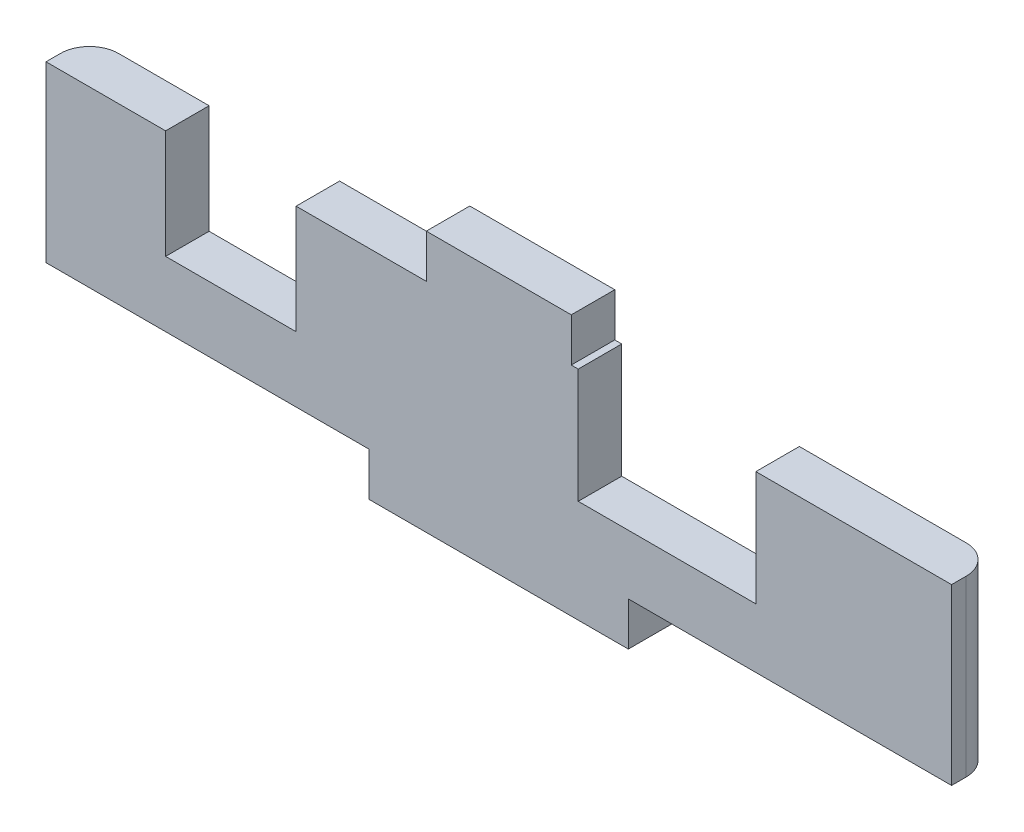
ISO-10303-21;
HEADER;
FILE_DESCRIPTION(('STEP AP214'),'2;1');
FILE_NAME('part.step','',(''),(''),'','','');
FILE_SCHEMA(('AUTOMOTIVE_DESIGN { 1 0 10303 214 1 1 1 1 }'));
ENDSEC;
DATA;
#1=APPLICATION_CONTEXT('core data for automotive mechanical design processes');
#2=APPLICATION_PROTOCOL_DEFINITION('international standard','automotive_design',2000,#1);
#3=PRODUCT_CONTEXT('',#1,'mechanical');
#4=PRODUCT('Part','Part','',(#3));
#5=PRODUCT_RELATED_PRODUCT_CATEGORY('part','',(#4));
#6=PRODUCT_DEFINITION_FORMATION('','',#4);
#7=PRODUCT_DEFINITION_CONTEXT('part definition',#1,'design');
#8=PRODUCT_DEFINITION('design','',#6,#7);
#9=PRODUCT_DEFINITION_SHAPE('','',#8);
#10=(LENGTH_UNIT() NAMED_UNIT(*) SI_UNIT(.MILLI.,.METRE.));
#11=(NAMED_UNIT(*) PLANE_ANGLE_UNIT() SI_UNIT($,.RADIAN.));
#12=(NAMED_UNIT(*) SI_UNIT($,.STERADIAN.) SOLID_ANGLE_UNIT());
#13=UNCERTAINTY_MEASURE_WITH_UNIT(LENGTH_MEASURE(1.E-05),#10,'distance_accuracy_value','');
#14=(GEOMETRIC_REPRESENTATION_CONTEXT(3) GLOBAL_UNCERTAINTY_ASSIGNED_CONTEXT((#13)) GLOBAL_UNIT_ASSIGNED_CONTEXT((#10,
#11,#12)) REPRESENTATION_CONTEXT('',''));
#15=CARTESIAN_POINT('',(0.,0.,0.));
#16=DIRECTION('',(0.,0.,1.));
#17=DIRECTION('',(1.,0.,0.));
#18=AXIS2_PLACEMENT_3D('',#15,#16,#17);
#19=CARTESIAN_POINT('',(31.23,9.,3.));
#20=DIRECTION('',(-1.,0.,0.));
#21=DIRECTION('',(0.,-1.,0.));
#22=AXIS2_PLACEMENT_3D('',#19,#20,#21);
#23=PLANE('',#22);
#24=DIRECTION('',(0.,0.,1.));
#25=VECTOR('',#24,1.);
#26=CARTESIAN_POINT('',(31.23,-5.99999999999999,0.));
#27=LINE('',#26,#25);
#28=CARTESIAN_POINT('',(31.23,-5.99999999999999,2.));
#29=VERTEX_POINT('',#28);
#30=CARTESIAN_POINT('',(31.23,-5.99999999999999,3.));
#31=VERTEX_POINT('',#30);
#32=EDGE_CURVE('E359',#29,#31,#27,.T.);
#33=ORIENTED_EDGE('',*,*,#32,.F.);
#34=DIRECTION('',(0.,1.,0.));
#35=VECTOR('',#34,1.);
#36=CARTESIAN_POINT('',(31.23,9.,2.));
#37=LINE('',#36,#35);
#38=CARTESIAN_POINT('',(31.23,6.,2.));
#39=VERTEX_POINT('',#38);
#40=EDGE_CURVE('E196',#29,#39,#37,.T.);
#41=ORIENTED_EDGE('',*,*,#40,.T.);
#42=DIRECTION('',(0.,0.,-1.));
#43=VECTOR('',#42,1.);
#44=CARTESIAN_POINT('',(31.23,6.,3.));
#45=LINE('',#44,#43);
#46=CARTESIAN_POINT('',(31.23,6.,3.));
#47=VERTEX_POINT('',#46);
#48=EDGE_CURVE('E180',#47,#39,#45,.T.);
#49=ORIENTED_EDGE('',*,*,#48,.F.);
#50=DIRECTION('',(0.,1.,0.));
#51=VECTOR('',#50,1.);
#52=CARTESIAN_POINT('',(31.23,9.,3.));
#53=LINE('',#52,#51);
#54=EDGE_CURVE('E194',#31,#47,#53,.T.);
#55=ORIENTED_EDGE('',*,*,#54,.F.);
#56=EDGE_LOOP('',(#33,#41,#49,#55));
#57=FACE_BOUND('',#56,.T.);
#58=ADVANCED_FACE('F32',(#57),#23,.F.);
#59=CARTESIAN_POINT('',(-31.23,9.,3.));
#60=DIRECTION('',(0.,-1.,0.));
#61=DIRECTION('',(0.,0.,-1.));
#62=AXIS2_PLACEMENT_3D('',#59,#60,#61);
#63=PLANE('',#62);
#64=DIRECTION('',(-1.,0.,0.));
#65=VECTOR('',#64,1.);
#66=CARTESIAN_POINT('',(-31.23,9.,3.));
#67=LINE('',#66,#65);
#68=CARTESIAN_POINT('',(5.,9.,3.));
#69=VERTEX_POINT('',#68);
#70=CARTESIAN_POINT('',(-5.,9.,3.));
#71=VERTEX_POINT('',#70);
#72=EDGE_CURVE('E205',#69,#71,#67,.T.);
#73=ORIENTED_EDGE('',*,*,#72,.F.);
#74=DIRECTION('',(0.,0.,-1.));
#75=VECTOR('',#74,1.);
#76=CARTESIAN_POINT('',(5.,9.,3.));
#77=LINE('',#76,#75);
#78=CARTESIAN_POINT('',(5.,9.,0.));
#79=VERTEX_POINT('',#78);
#80=EDGE_CURVE('E312',#69,#79,#77,.T.);
#81=ORIENTED_EDGE('',*,*,#80,.T.);
#82=DIRECTION('',(-1.,0.,0.));
#83=VECTOR('',#82,1.);
#84=CARTESIAN_POINT('',(-31.23,9.,0.));
#85=LINE('',#84,#83);
#86=CARTESIAN_POINT('',(-5.,9.,0.));
#87=VERTEX_POINT('',#86);
#88=EDGE_CURVE('E212',#79,#87,#85,.T.);
#89=ORIENTED_EDGE('',*,*,#88,.T.);
#90=DIRECTION('',(0.,0.,-1.));
#91=VECTOR('',#90,1.);
#92=CARTESIAN_POINT('',(-5.,9.,3.));
#93=LINE('',#92,#91);
#94=EDGE_CURVE('E299',#71,#87,#93,.T.);
#95=ORIENTED_EDGE('',*,*,#94,.F.);
#96=EDGE_LOOP('',(#73,#81,#89,#95));
#97=FACE_BOUND('',#96,.T.);
#98=ADVANCED_FACE('F375',(#97),#63,.F.);
#99=CARTESIAN_POINT('',(-31.23,9.,3.));
#100=DIRECTION('',(1.,0.,0.));
#101=DIRECTION('',(0.,1.,0.));
#102=AXIS2_PLACEMENT_3D('',#99,#100,#101);
#103=PLANE('',#102);
#104=DIRECTION('',(0.,0.,-1.));
#105=VECTOR('',#104,1.);
#106=CARTESIAN_POINT('',(-31.23,6.,3.));
#107=LINE('',#106,#105);
#108=CARTESIAN_POINT('',(-31.23,6.,3.));
#109=VERTEX_POINT('',#108);
#110=CARTESIAN_POINT('',(-31.23,6.,2.));
#111=VERTEX_POINT('',#110);
#112=EDGE_CURVE('E247',#109,#111,#107,.T.);
#113=ORIENTED_EDGE('',*,*,#112,.T.);
#114=DIRECTION('',(0.,-1.,0.));
#115=VECTOR('',#114,1.);
#116=CARTESIAN_POINT('',(-31.23,9.,2.));
#117=LINE('',#116,#115);
#118=CARTESIAN_POINT('',(-31.23,-6.,2.));
#119=VERTEX_POINT('',#118);
#120=EDGE_CURVE('E232',#111,#119,#117,.T.);
#121=ORIENTED_EDGE('',*,*,#120,.T.);
#122=DIRECTION('',(0.,0.,1.));
#123=VECTOR('',#122,1.);
#124=CARTESIAN_POINT('',(-31.23,-6.,0.));
#125=LINE('',#124,#123);
#126=CARTESIAN_POINT('',(-31.23,-6.,3.));
#127=VERTEX_POINT('',#126);
#128=EDGE_CURVE('E268',#119,#127,#125,.T.);
#129=ORIENTED_EDGE('',*,*,#128,.T.);
#130=DIRECTION('',(0.,-1.,0.));
#131=VECTOR('',#130,1.);
#132=CARTESIAN_POINT('',(-31.23,9.,3.));
#133=LINE('',#132,#131);
#134=EDGE_CURVE('E209',#109,#127,#133,.T.);
#135=ORIENTED_EDGE('',*,*,#134,.F.);
#136=EDGE_LOOP('',(#113,#121,#129,#135));
#137=FACE_BOUND('',#136,.T.);
#138=ADVANCED_FACE('F256',(#137),#103,.F.);
#139=CARTESIAN_POINT('',(-31.23,-9.,3.));
#140=DIRECTION('',(0.,1.,0.));
#141=DIRECTION('',(0.,0.,1.));
#142=AXIS2_PLACEMENT_3D('',#139,#140,#141);
#143=PLANE('',#142);
#144=DIRECTION('',(1.,0.,0.));
#145=VECTOR('',#144,1.);
#146=CARTESIAN_POINT('',(-31.23,-9.,0.));
#147=LINE('',#146,#145);
#148=CARTESIAN_POINT('',(-8.935,-9.00000000000001,0.));
#149=VERTEX_POINT('',#148);
#150=CARTESIAN_POINT('',(8.93500000000001,-9.,0.));
#151=VERTEX_POINT('',#150);
#152=EDGE_CURVE('E206',#149,#151,#147,.T.);
#153=ORIENTED_EDGE('',*,*,#152,.T.);
#154=DIRECTION('',(0.,0.,1.));
#155=VECTOR('',#154,1.);
#156=CARTESIAN_POINT('',(8.93500000000001,-9.,0.));
#157=LINE('',#156,#155);
#158=CARTESIAN_POINT('',(8.93500000000001,-9.,3.));
#159=VERTEX_POINT('',#158);
#160=EDGE_CURVE('E225',#151,#159,#157,.T.);
#161=ORIENTED_EDGE('',*,*,#160,.T.);
#162=DIRECTION('',(1.,0.,0.));
#163=VECTOR('',#162,1.);
#164=CARTESIAN_POINT('',(-31.23,-9.,3.));
#165=LINE('',#164,#163);
#166=CARTESIAN_POINT('',(-8.935,-9.00000000000001,3.));
#167=VERTEX_POINT('',#166);
#168=EDGE_CURVE('E220',#167,#159,#165,.T.);
#169=ORIENTED_EDGE('',*,*,#168,.F.);
#170=DIRECTION('',(0.,0.,1.));
#171=VECTOR('',#170,1.);
#172=CARTESIAN_POINT('',(-8.935,-9.00000000000001,0.));
#173=LINE('',#172,#171);
#174=EDGE_CURVE('E215',#149,#167,#173,.T.);
#175=ORIENTED_EDGE('',*,*,#174,.F.);
#176=EDGE_LOOP('',(#153,#161,#169,#175));
#177=FACE_BOUND('',#176,.T.);
#178=ADVANCED_FACE('F385',(#177),#143,.F.);
#179=CARTESIAN_POINT('',(0.,0.,3.));
#180=DIRECTION('',(0.,0.,1.));
#181=DIRECTION('',(1.,0.,0.));
#182=AXIS2_PLACEMENT_3D('',#179,#180,#181);
#183=PLANE('',#182);
#184=DIRECTION('',(0.,1.,0.));
#185=VECTOR('',#184,1.);
#186=CARTESIAN_POINT('',(5.,9.,3.));
#187=LINE('',#186,#185);
#188=CARTESIAN_POINT('',(5.,6.,3.));
#189=VERTEX_POINT('',#188);
#190=EDGE_CURVE('E187',#189,#69,#187,.T.);
#191=ORIENTED_EDGE('',*,*,#190,.T.);
#192=ORIENTED_EDGE('',*,*,#72,.T.);
#193=DIRECTION('',(0.,-1.,0.));
#194=VECTOR('',#193,1.);
#195=CARTESIAN_POINT('',(-5.,9.,3.));
#196=LINE('',#195,#194);
#197=CARTESIAN_POINT('',(-5.,6.,3.));
#198=VERTEX_POINT('',#197);
#199=EDGE_CURVE('E296',#71,#198,#196,.T.);
#200=ORIENTED_EDGE('',*,*,#199,.T.);
#201=DIRECTION('',(-1.,0.,0.));
#202=VECTOR('',#201,1.);
#203=CARTESIAN_POINT('',(-31.23,6.,3.));
#204=LINE('',#203,#202);
#205=CARTESIAN_POINT('',(-13.98,6.,3.));
#206=VERTEX_POINT('',#205);
#207=EDGE_CURVE('E295',#198,#206,#204,.T.);
#208=ORIENTED_EDGE('',*,*,#207,.T.);
#209=DIRECTION('',(0.,1.,0.));
#210=VECTOR('',#209,1.);
#211=CARTESIAN_POINT('',(-13.98,9.,3.));
#212=LINE('',#211,#210);
#213=CARTESIAN_POINT('',(-13.98,-1.5,3.));
#214=VERTEX_POINT('',#213);
#215=EDGE_CURVE('E337',#214,#206,#212,.T.);
#216=ORIENTED_EDGE('',*,*,#215,.F.);
#217=DIRECTION('',(1.,0.,0.));
#218=VECTOR('',#217,1.);
#219=CARTESIAN_POINT('',(-22.98,-1.5,3.));
#220=LINE('',#219,#218);
#221=CARTESIAN_POINT('',(-22.98,-1.5,3.));
#222=VERTEX_POINT('',#221);
#223=EDGE_CURVE('E345',#222,#214,#220,.T.);
#224=ORIENTED_EDGE('',*,*,#223,.F.);
#225=DIRECTION('',(0.,-1.,0.));
#226=VECTOR('',#225,1.);
#227=CARTESIAN_POINT('',(-22.98,9.,3.));
#228=LINE('',#227,#226);
#229=CARTESIAN_POINT('',(-22.98,6.,3.));
#230=VERTEX_POINT('',#229);
#231=EDGE_CURVE('E293',#230,#222,#228,.T.);
#232=ORIENTED_EDGE('',*,*,#231,.F.);
#233=EDGE_CURVE('E291',#230,#109,#204,.T.);
#234=ORIENTED_EDGE('',*,*,#233,.T.);
#235=ORIENTED_EDGE('',*,*,#134,.T.);
#236=DIRECTION('',(-1.,0.,0.));
#237=VECTOR('',#236,1.);
#238=CARTESIAN_POINT('',(-31.23,-6.,3.));
#239=LINE('',#238,#237);
#240=CARTESIAN_POINT('',(-8.935,-6.,3.));
#241=VERTEX_POINT('',#240);
#242=EDGE_CURVE('E275',#241,#127,#239,.T.);
#243=ORIENTED_EDGE('',*,*,#242,.F.);
#244=DIRECTION('',(0.,1.,0.));
#245=VECTOR('',#244,1.);
#246=CARTESIAN_POINT('',(-8.935,-9.00000000000001,3.));
#247=LINE('',#246,#245);
#248=EDGE_CURVE('E279',#167,#241,#247,.T.);
#249=ORIENTED_EDGE('',*,*,#248,.F.);
#250=ORIENTED_EDGE('',*,*,#168,.T.);
#251=DIRECTION('',(0.,-1.,0.));
#252=VECTOR('',#251,1.);
#253=CARTESIAN_POINT('',(8.93500000000001,-9.,3.));
#254=LINE('',#253,#252);
#255=CARTESIAN_POINT('',(8.93500000000001,-6.,3.));
#256=VERTEX_POINT('',#255);
#257=EDGE_CURVE('E356',#256,#159,#254,.T.);
#258=ORIENTED_EDGE('',*,*,#257,.F.);
#259=DIRECTION('',(-1.,0.,0.));
#260=VECTOR('',#259,1.);
#261=CARTESIAN_POINT('',(31.23,-5.99999999999999,3.));
#262=LINE('',#261,#260);
#263=EDGE_CURVE('E204',#31,#256,#262,.T.);
#264=ORIENTED_EDGE('',*,*,#263,.F.);
#265=ORIENTED_EDGE('',*,*,#54,.T.);
#266=DIRECTION('',(-1.,0.,0.));
#267=VECTOR('',#266,1.);
#268=CARTESIAN_POINT('',(31.23,6.,3.));
#269=LINE('',#268,#267);
#270=CARTESIAN_POINT('',(17.73,6.,3.));
#271=VERTEX_POINT('',#270);
#272=EDGE_CURVE('E177',#47,#271,#269,.T.);
#273=ORIENTED_EDGE('',*,*,#272,.T.);
#274=DIRECTION('',(0.,1.,0.));
#275=VECTOR('',#274,1.);
#276=CARTESIAN_POINT('',(17.73,9.,3.));
#277=LINE('',#276,#275);
#278=CARTESIAN_POINT('',(17.73,-1.9,3.));
#279=VERTEX_POINT('',#278);
#280=EDGE_CURVE('E324',#279,#271,#277,.T.);
#281=ORIENTED_EDGE('',*,*,#280,.F.);
#282=DIRECTION('',(1.,0.,0.));
#283=VECTOR('',#282,1.);
#284=CARTESIAN_POINT('',(17.73,-1.9,3.));
#285=LINE('',#284,#283);
#286=CARTESIAN_POINT('',(5.48000000000001,-1.9,3.));
#287=VERTEX_POINT('',#286);
#288=EDGE_CURVE('E318',#287,#279,#285,.T.);
#289=ORIENTED_EDGE('',*,*,#288,.F.);
#290=DIRECTION('',(0.,-1.,0.));
#291=VECTOR('',#290,1.);
#292=CARTESIAN_POINT('',(5.48,9.,3.));
#293=LINE('',#292,#291);
#294=CARTESIAN_POINT('',(5.48,6.,3.));
#295=VERTEX_POINT('',#294);
#296=EDGE_CURVE('E326',#295,#287,#293,.T.);
#297=ORIENTED_EDGE('',*,*,#296,.F.);
#298=EDGE_CURVE('E188',#295,#189,#269,.T.);
#299=ORIENTED_EDGE('',*,*,#298,.T.);
#300=EDGE_LOOP('',(#191,#192,#200,#208,#216,#224,#232,#234,#235,#243,#249,#250,#258,#264,#265,
#273,#281,#289,#297,#299));
#301=FACE_BOUND('',#300,.T.);
#302=ADVANCED_FACE('F201',(#301),#183,.T.);
#303=CARTESIAN_POINT('',(0.,0.,0.));
#304=DIRECTION('',(0.,0.,1.));
#305=DIRECTION('',(1.,0.,0.));
#306=AXIS2_PLACEMENT_3D('',#303,#304,#305);
#307=PLANE('',#306);
#308=DIRECTION('',(-1.,0.,0.));
#309=VECTOR('',#308,1.);
#310=CARTESIAN_POINT('',(31.23,6.,0.));
#311=LINE('',#310,#309);
#312=CARTESIAN_POINT('',(29.23,6.,0.));
#313=VERTEX_POINT('',#312);
#314=CARTESIAN_POINT('',(17.73,6.,0.));
#315=VERTEX_POINT('',#314);
#316=EDGE_CURVE('E451',#313,#315,#311,.T.);
#317=ORIENTED_EDGE('',*,*,#316,.F.);
#318=DIRECTION('',(0.,1.,0.));
#319=VECTOR('',#318,1.);
#320=CARTESIAN_POINT('',(29.23,0.,0.));
#321=LINE('',#320,#319);
#322=CARTESIAN_POINT('',(29.23,-5.99999999999999,0.));
#323=VERTEX_POINT('',#322);
#324=EDGE_CURVE('E40',#313,#323,#321,.F.);
#325=ORIENTED_EDGE('',*,*,#324,.T.);
#326=DIRECTION('',(-1.,0.,0.));
#327=VECTOR('',#326,1.);
#328=CARTESIAN_POINT('',(31.23,-5.99999999999999,0.));
#329=LINE('',#328,#327);
#330=CARTESIAN_POINT('',(8.93500000000001,-6.,0.));
#331=VERTEX_POINT('',#330);
#332=EDGE_CURVE('E353',#323,#331,#329,.T.);
#333=ORIENTED_EDGE('',*,*,#332,.T.);
#334=DIRECTION('',(0.,-1.,0.));
#335=VECTOR('',#334,1.);
#336=CARTESIAN_POINT('',(8.93500000000001,-9.,0.));
#337=LINE('',#336,#335);
#338=EDGE_CURVE('E355',#331,#151,#337,.T.);
#339=ORIENTED_EDGE('',*,*,#338,.T.);
#340=ORIENTED_EDGE('',*,*,#152,.F.);
#341=DIRECTION('',(0.,1.,0.));
#342=VECTOR('',#341,1.);
#343=CARTESIAN_POINT('',(-8.935,-9.00000000000001,0.));
#344=LINE('',#343,#342);
#345=CARTESIAN_POINT('',(-8.935,-6.,0.));
#346=VERTEX_POINT('',#345);
#347=EDGE_CURVE('E272',#149,#346,#344,.T.);
#348=ORIENTED_EDGE('',*,*,#347,.T.);
#349=DIRECTION('',(-1.,0.,0.));
#350=VECTOR('',#349,1.);
#351=CARTESIAN_POINT('',(-31.23,-6.,0.));
#352=LINE('',#351,#350);
#353=CARTESIAN_POINT('',(-29.23,-6.,0.));
#354=VERTEX_POINT('',#353);
#355=EDGE_CURVE('E265',#346,#354,#352,.T.);
#356=ORIENTED_EDGE('',*,*,#355,.T.);
#357=DIRECTION('',(0.,-1.,0.));
#358=VECTOR('',#357,1.);
#359=CARTESIAN_POINT('',(-29.23,0.,0.));
#360=LINE('',#359,#358);
#361=CARTESIAN_POINT('',(-29.23,6.,0.));
#362=VERTEX_POINT('',#361);
#363=EDGE_CURVE('E237',#354,#362,#360,.F.);
#364=ORIENTED_EDGE('',*,*,#363,.T.);
#365=DIRECTION('',(-1.,0.,0.));
#366=VECTOR('',#365,1.);
#367=CARTESIAN_POINT('',(-31.23,6.,0.));
#368=LINE('',#367,#366);
#369=CARTESIAN_POINT('',(-22.98,6.,0.));
#370=VERTEX_POINT('',#369);
#371=EDGE_CURVE('E250',#370,#362,#368,.T.);
#372=ORIENTED_EDGE('',*,*,#371,.F.);
#373=DIRECTION('',(0.,-1.,0.));
#374=VECTOR('',#373,1.);
#375=CARTESIAN_POINT('',(-22.98,9.,0.));
#376=LINE('',#375,#374);
#377=CARTESIAN_POINT('',(-22.98,-1.5,0.));
#378=VERTEX_POINT('',#377);
#379=EDGE_CURVE('E334',#370,#378,#376,.T.);
#380=ORIENTED_EDGE('',*,*,#379,.T.);
#381=DIRECTION('',(1.,0.,0.));
#382=VECTOR('',#381,1.);
#383=CARTESIAN_POINT('',(-22.98,-1.5,0.));
#384=LINE('',#383,#382);
#385=CARTESIAN_POINT('',(-13.98,-1.5,0.));
#386=VERTEX_POINT('',#385);
#387=EDGE_CURVE('E336',#378,#386,#384,.T.);
#388=ORIENTED_EDGE('',*,*,#387,.T.);
#389=DIRECTION('',(0.,1.,0.));
#390=VECTOR('',#389,1.);
#391=CARTESIAN_POINT('',(-13.98,9.,0.));
#392=LINE('',#391,#390);
#393=CARTESIAN_POINT('',(-13.98,6.,0.));
#394=VERTEX_POINT('',#393);
#395=EDGE_CURVE('E340',#386,#394,#392,.T.);
#396=ORIENTED_EDGE('',*,*,#395,.T.);
#397=CARTESIAN_POINT('',(-5.,6.,0.));
#398=VERTEX_POINT('',#397);
#399=EDGE_CURVE('E301',#398,#394,#368,.T.);
#400=ORIENTED_EDGE('',*,*,#399,.F.);
#401=DIRECTION('',(0.,-1.,0.));
#402=VECTOR('',#401,1.);
#403=CARTESIAN_POINT('',(-5.,9.,0.));
#404=LINE('',#403,#402);
#405=EDGE_CURVE('E304',#87,#398,#404,.T.);
#406=ORIENTED_EDGE('',*,*,#405,.F.);
#407=ORIENTED_EDGE('',*,*,#88,.F.);
#408=DIRECTION('',(0.,1.,0.));
#409=VECTOR('',#408,1.);
#410=CARTESIAN_POINT('',(5.,9.,0.));
#411=LINE('',#410,#409);
#412=CARTESIAN_POINT('',(5.,6.,0.));
#413=VERTEX_POINT('',#412);
#414=EDGE_CURVE('E446',#413,#79,#411,.T.);
#415=ORIENTED_EDGE('',*,*,#414,.F.);
#416=CARTESIAN_POINT('',(5.48,6.,0.));
#417=VERTEX_POINT('',#416);
#418=EDGE_CURVE('E258',#417,#413,#311,.T.);
#419=ORIENTED_EDGE('',*,*,#418,.F.);
#420=DIRECTION('',(0.,-1.,0.));
#421=VECTOR('',#420,1.);
#422=CARTESIAN_POINT('',(5.48,9.,0.));
#423=LINE('',#422,#421);
#424=CARTESIAN_POINT('',(5.48000000000001,-1.9,0.));
#425=VERTEX_POINT('',#424);
#426=EDGE_CURVE('E317',#417,#425,#423,.T.);
#427=ORIENTED_EDGE('',*,*,#426,.T.);
#428=DIRECTION('',(1.,0.,0.));
#429=VECTOR('',#428,1.);
#430=CARTESIAN_POINT('',(17.73,-1.9,0.));
#431=LINE('',#430,#429);
#432=CARTESIAN_POINT('',(17.73,-1.9,0.));
#433=VERTEX_POINT('',#432);
#434=EDGE_CURVE('E320',#425,#433,#431,.T.);
#435=ORIENTED_EDGE('',*,*,#434,.T.);
#436=DIRECTION('',(0.,1.,0.));
#437=VECTOR('',#436,1.);
#438=CARTESIAN_POINT('',(17.73,9.,0.));
#439=LINE('',#438,#437);
#440=EDGE_CURVE('E314',#433,#315,#439,.T.);
#441=ORIENTED_EDGE('',*,*,#440,.T.);
#442=EDGE_LOOP('',(#317,#325,#333,#339,#340,#348,#356,#364,#372,#380,#388,#396,#400,#406,#407,
#415,#419,#427,#435,#441));
#443=FACE_BOUND('',#442,.T.);
#444=ADVANCED_FACE('F270',(#443),#307,.F.);
#445=CARTESIAN_POINT('',(-31.23,-6.,0.));
#446=DIRECTION('',(0.,1.,0.));
#447=DIRECTION('',(0.,0.,1.));
#448=AXIS2_PLACEMENT_3D('',#445,#446,#447);
#449=PLANE('',#448);
#450=ORIENTED_EDGE('',*,*,#128,.F.);
#451=CARTESIAN_POINT('',(-29.23,-6.,2.));
#452=DIRECTION('',(0.,1.,0.));
#453=DIRECTION('',(0.,0.,1.));
#454=AXIS2_PLACEMENT_3D('',#451,#452,#453);
#455=CIRCLE('',#454,2.);
#456=EDGE_CURVE('E235',#119,#354,#455,.F.);
#457=ORIENTED_EDGE('',*,*,#456,.T.);
#458=ORIENTED_EDGE('',*,*,#355,.F.);
#459=DIRECTION('',(0.,0.,1.));
#460=VECTOR('',#459,1.);
#461=CARTESIAN_POINT('',(-8.935,-6.,0.));
#462=LINE('',#461,#460);
#463=EDGE_CURVE('E274',#346,#241,#462,.T.);
#464=ORIENTED_EDGE('',*,*,#463,.T.);
#465=ORIENTED_EDGE('',*,*,#242,.T.);
#466=EDGE_LOOP('',(#450,#457,#458,#464,#465));
#467=FACE_BOUND('',#466,.T.);
#468=ADVANCED_FACE('F264',(#467),#449,.F.);
#469=CARTESIAN_POINT('',(-8.935,-9.00000000000001,0.));
#470=DIRECTION('',(1.,0.,0.));
#471=DIRECTION('',(0.,0.,-1.));
#472=AXIS2_PLACEMENT_3D('',#469,#470,#471);
#473=PLANE('',#472);
#474=ORIENTED_EDGE('',*,*,#248,.T.);
#475=ORIENTED_EDGE('',*,*,#463,.F.);
#476=ORIENTED_EDGE('',*,*,#347,.F.);
#477=ORIENTED_EDGE('',*,*,#174,.T.);
#478=EDGE_LOOP('',(#474,#475,#476,#477));
#479=FACE_BOUND('',#478,.T.);
#480=ADVANCED_FACE('F287',(#479),#473,.F.);
#481=CARTESIAN_POINT('',(8.93500000000001,-9.,0.));
#482=DIRECTION('',(-1.,0.,0.));
#483=DIRECTION('',(0.,0.,1.));
#484=AXIS2_PLACEMENT_3D('',#481,#482,#483);
#485=PLANE('',#484);
#486=ORIENTED_EDGE('',*,*,#257,.T.);
#487=ORIENTED_EDGE('',*,*,#160,.F.);
#488=ORIENTED_EDGE('',*,*,#338,.F.);
#489=DIRECTION('',(0.,0.,1.));
#490=VECTOR('',#489,1.);
#491=CARTESIAN_POINT('',(8.93500000000001,-6.,0.));
#492=LINE('',#491,#490);
#493=EDGE_CURVE('E364',#331,#256,#492,.T.);
#494=ORIENTED_EDGE('',*,*,#493,.T.);
#495=EDGE_LOOP('',(#486,#487,#488,#494));
#496=FACE_BOUND('',#495,.T.);
#497=ADVANCED_FACE('F395',(#496),#485,.F.);
#498=CARTESIAN_POINT('',(31.23,-5.99999999999999,0.));
#499=DIRECTION('',(0.,1.,0.));
#500=DIRECTION('',(-1.,0.,0.));
#501=AXIS2_PLACEMENT_3D('',#498,#499,#500);
#502=PLANE('',#501);
#503=ORIENTED_EDGE('',*,*,#332,.F.);
#504=CARTESIAN_POINT('',(29.23,-5.99999999999999,2.));
#505=DIRECTION('',(0.,1.,0.));
#506=DIRECTION('',(-1.,0.,0.));
#507=AXIS2_PLACEMENT_3D('',#504,#505,#506);
#508=CIRCLE('',#507,2.);
#509=EDGE_CURVE('E11',#323,#29,#508,.F.);
#510=ORIENTED_EDGE('',*,*,#509,.T.);
#511=ORIENTED_EDGE('',*,*,#32,.T.);
#512=ORIENTED_EDGE('',*,*,#263,.T.);
#513=ORIENTED_EDGE('',*,*,#493,.F.);
#514=EDGE_LOOP('',(#503,#510,#511,#512,#513));
#515=FACE_BOUND('',#514,.T.);
#516=ADVANCED_FACE('F366',(#515),#502,.F.);
#517=CARTESIAN_POINT('',(-22.98,9.,0.));
#518=DIRECTION('',(-1.,0.,0.));
#519=DIRECTION('',(0.,0.,1.));
#520=AXIS2_PLACEMENT_3D('',#517,#518,#519);
#521=PLANE('',#520);
#522=ORIENTED_EDGE('',*,*,#379,.F.);
#523=DIRECTION('',(0.,0.,1.));
#524=VECTOR('',#523,1.);
#525=CARTESIAN_POINT('',(-22.98,6.,0.));
#526=LINE('',#525,#524);
#527=EDGE_CURVE('E311',#370,#230,#526,.T.);
#528=ORIENTED_EDGE('',*,*,#527,.T.);
#529=ORIENTED_EDGE('',*,*,#231,.T.);
#530=DIRECTION('',(0.,0.,1.));
#531=VECTOR('',#530,1.);
#532=CARTESIAN_POINT('',(-22.98,-1.5,0.));
#533=LINE('',#532,#531);
#534=EDGE_CURVE('E343',#378,#222,#533,.T.);
#535=ORIENTED_EDGE('',*,*,#534,.F.);
#536=EDGE_LOOP('',(#522,#528,#529,#535));
#537=FACE_BOUND('',#536,.T.);
#538=ADVANCED_FACE('F400',(#537),#521,.F.);
#539=CARTESIAN_POINT('',(-13.98,9.,0.));
#540=DIRECTION('',(1.,0.,0.));
#541=DIRECTION('',(0.,1.,0.));
#542=AXIS2_PLACEMENT_3D('',#539,#540,#541);
#543=PLANE('',#542);
#544=ORIENTED_EDGE('',*,*,#215,.T.);
#545=DIRECTION('',(0.,0.,-1.));
#546=VECTOR('',#545,1.);
#547=CARTESIAN_POINT('',(-13.98,6.,0.));
#548=LINE('',#547,#546);
#549=EDGE_CURVE('E229',#206,#394,#548,.T.);
#550=ORIENTED_EDGE('',*,*,#549,.T.);
#551=ORIENTED_EDGE('',*,*,#395,.F.);
#552=DIRECTION('',(0.,0.,1.));
#553=VECTOR('',#552,1.);
#554=CARTESIAN_POINT('',(-13.98,-1.5,0.));
#555=LINE('',#554,#553);
#556=EDGE_CURVE('E327',#386,#214,#555,.T.);
#557=ORIENTED_EDGE('',*,*,#556,.T.);
#558=EDGE_LOOP('',(#544,#550,#551,#557));
#559=FACE_BOUND('',#558,.T.);
#560=ADVANCED_FACE('F406',(#559),#543,.F.);
#561=CARTESIAN_POINT('',(-22.98,-1.5,0.));
#562=DIRECTION('',(0.,-1.,0.));
#563=DIRECTION('',(0.,0.,-1.));
#564=AXIS2_PLACEMENT_3D('',#561,#562,#563);
#565=PLANE('',#564);
#566=ORIENTED_EDGE('',*,*,#223,.T.);
#567=ORIENTED_EDGE('',*,*,#556,.F.);
#568=ORIENTED_EDGE('',*,*,#387,.F.);
#569=ORIENTED_EDGE('',*,*,#534,.T.);
#570=EDGE_LOOP('',(#566,#567,#568,#569));
#571=FACE_BOUND('',#570,.T.);
#572=ADVANCED_FACE('F408',(#571),#565,.F.);
#573=CARTESIAN_POINT('',(17.73,9.,0.));
#574=DIRECTION('',(1.,0.,0.));
#575=DIRECTION('',(0.,1.,0.));
#576=AXIS2_PLACEMENT_3D('',#573,#574,#575);
#577=PLANE('',#576);
#578=ORIENTED_EDGE('',*,*,#280,.T.);
#579=DIRECTION('',(0.,0.,-1.));
#580=VECTOR('',#579,1.);
#581=CARTESIAN_POINT('',(17.73,6.,0.));
#582=LINE('',#581,#580);
#583=EDGE_CURVE('E182',#271,#315,#582,.T.);
#584=ORIENTED_EDGE('',*,*,#583,.T.);
#585=ORIENTED_EDGE('',*,*,#440,.F.);
#586=DIRECTION('',(0.,0.,1.));
#587=VECTOR('',#586,1.);
#588=CARTESIAN_POINT('',(17.73,-1.9,0.));
#589=LINE('',#588,#587);
#590=EDGE_CURVE('E282',#433,#279,#589,.T.);
#591=ORIENTED_EDGE('',*,*,#590,.T.);
#592=EDGE_LOOP('',(#578,#584,#585,#591));
#593=FACE_BOUND('',#592,.T.);
#594=ADVANCED_FACE('F411',(#593),#577,.F.);
#595=CARTESIAN_POINT('',(17.73,-1.9,0.));
#596=DIRECTION('',(0.,-1.,0.));
#597=DIRECTION('',(1.,0.,0.));
#598=AXIS2_PLACEMENT_3D('',#595,#596,#597);
#599=PLANE('',#598);
#600=ORIENTED_EDGE('',*,*,#288,.T.);
#601=ORIENTED_EDGE('',*,*,#590,.F.);
#602=ORIENTED_EDGE('',*,*,#434,.F.);
#603=DIRECTION('',(0.,0.,1.));
#604=VECTOR('',#603,1.);
#605=CARTESIAN_POINT('',(5.48000000000001,-1.9,0.));
#606=LINE('',#605,#604);
#607=EDGE_CURVE('E323',#425,#287,#606,.T.);
#608=ORIENTED_EDGE('',*,*,#607,.T.);
#609=EDGE_LOOP('',(#600,#601,#602,#608));
#610=FACE_BOUND('',#609,.T.);
#611=ADVANCED_FACE('F418',(#610),#599,.F.);
#612=CARTESIAN_POINT('',(5.48,9.,0.));
#613=DIRECTION('',(-1.,0.,0.));
#614=DIRECTION('',(0.,-1.,0.));
#615=AXIS2_PLACEMENT_3D('',#612,#613,#614);
#616=PLANE('',#615);
#617=ORIENTED_EDGE('',*,*,#426,.F.);
#618=DIRECTION('',(0.,0.,1.));
#619=VECTOR('',#618,1.);
#620=CARTESIAN_POINT('',(5.48,6.,0.));
#621=LINE('',#620,#619);
#622=EDGE_CURVE('E223',#417,#295,#621,.T.);
#623=ORIENTED_EDGE('',*,*,#622,.T.);
#624=ORIENTED_EDGE('',*,*,#296,.T.);
#625=ORIENTED_EDGE('',*,*,#607,.F.);
#626=EDGE_LOOP('',(#617,#623,#624,#625));
#627=FACE_BOUND('',#626,.T.);
#628=ADVANCED_FACE('F420',(#627),#616,.F.);
#629=CARTESIAN_POINT('',(31.23,6.,3.));
#630=DIRECTION('',(0.,-1.,0.));
#631=DIRECTION('',(0.,0.,-1.));
#632=AXIS2_PLACEMENT_3D('',#629,#630,#631);
#633=PLANE('',#632);
#634=ORIENTED_EDGE('',*,*,#418,.T.);
#635=DIRECTION('',(0.,0.,-1.));
#636=VECTOR('',#635,1.);
#637=CARTESIAN_POINT('',(5.,6.,3.));
#638=LINE('',#637,#636);
#639=EDGE_CURVE('E197',#189,#413,#638,.T.);
#640=ORIENTED_EDGE('',*,*,#639,.F.);
#641=ORIENTED_EDGE('',*,*,#298,.F.);
#642=ORIENTED_EDGE('',*,*,#622,.F.);
#643=EDGE_LOOP('',(#634,#640,#641,#642));
#644=FACE_BOUND('',#643,.T.);
#645=ADVANCED_FACE('F423',(#644),#633,.F.);
#646=CARTESIAN_POINT('',(5.,9.,3.));
#647=DIRECTION('',(-1.,0.,0.));
#648=DIRECTION('',(0.,0.,1.));
#649=AXIS2_PLACEMENT_3D('',#646,#647,#648);
#650=PLANE('',#649);
#651=ORIENTED_EDGE('',*,*,#414,.T.);
#652=ORIENTED_EDGE('',*,*,#80,.F.);
#653=ORIENTED_EDGE('',*,*,#190,.F.);
#654=ORIENTED_EDGE('',*,*,#639,.T.);
#655=EDGE_LOOP('',(#651,#652,#653,#654));
#656=FACE_BOUND('',#655,.T.);
#657=ADVANCED_FACE('F437',(#656),#650,.F.);
#658=ORIENTED_EDGE('',*,*,#48,.T.);
#659=CARTESIAN_POINT('',(29.23,6.,2.));
#660=DIRECTION('',(0.,-1.,0.));
#661=DIRECTION('',(0.,0.,-1.));
#662=AXIS2_PLACEMENT_3D('',#659,#660,#661);
#663=CIRCLE('',#662,2.);
#664=EDGE_CURVE('E54',#39,#313,#663,.F.);
#665=ORIENTED_EDGE('',*,*,#664,.T.);
#666=ORIENTED_EDGE('',*,*,#316,.T.);
#667=ORIENTED_EDGE('',*,*,#583,.F.);
#668=ORIENTED_EDGE('',*,*,#272,.F.);
#669=EDGE_LOOP('',(#658,#665,#666,#667,#668));
#670=FACE_BOUND('',#669,.T.);
#671=ADVANCED_FACE('F179',(#670),#633,.F.);
#672=CARTESIAN_POINT('',(-31.23,6.,3.));
#673=DIRECTION('',(0.,-1.,0.));
#674=DIRECTION('',(1.,0.,0.));
#675=AXIS2_PLACEMENT_3D('',#672,#673,#674);
#676=PLANE('',#675);
#677=ORIENTED_EDGE('',*,*,#207,.F.);
#678=DIRECTION('',(0.,0.,-1.));
#679=VECTOR('',#678,1.);
#680=CARTESIAN_POINT('',(-5.,6.,3.));
#681=LINE('',#680,#679);
#682=EDGE_CURVE('E259',#198,#398,#681,.T.);
#683=ORIENTED_EDGE('',*,*,#682,.T.);
#684=ORIENTED_EDGE('',*,*,#399,.T.);
#685=ORIENTED_EDGE('',*,*,#549,.F.);
#686=EDGE_LOOP('',(#677,#683,#684,#685));
#687=FACE_BOUND('',#686,.T.);
#688=ADVANCED_FACE('F431',(#687),#676,.F.);
#689=CARTESIAN_POINT('',(-5.,9.,3.));
#690=DIRECTION('',(1.,0.,0.));
#691=DIRECTION('',(0.,1.,0.));
#692=AXIS2_PLACEMENT_3D('',#689,#690,#691);
#693=PLANE('',#692);
#694=ORIENTED_EDGE('',*,*,#405,.T.);
#695=ORIENTED_EDGE('',*,*,#682,.F.);
#696=ORIENTED_EDGE('',*,*,#199,.F.);
#697=ORIENTED_EDGE('',*,*,#94,.T.);
#698=EDGE_LOOP('',(#694,#695,#696,#697));
#699=FACE_BOUND('',#698,.T.);
#700=ADVANCED_FACE('F428',(#699),#693,.F.);
#701=ORIENTED_EDGE('',*,*,#371,.T.);
#702=CARTESIAN_POINT('',(-29.23,6.,2.));
#703=DIRECTION('',(0.,-1.,0.));
#704=DIRECTION('',(1.,0.,0.));
#705=AXIS2_PLACEMENT_3D('',#702,#703,#704);
#706=CIRCLE('',#705,2.);
#707=EDGE_CURVE('E239',#362,#111,#706,.F.);
#708=ORIENTED_EDGE('',*,*,#707,.T.);
#709=ORIENTED_EDGE('',*,*,#112,.F.);
#710=ORIENTED_EDGE('',*,*,#233,.F.);
#711=ORIENTED_EDGE('',*,*,#527,.F.);
#712=EDGE_LOOP('',(#701,#708,#709,#710,#711));
#713=FACE_BOUND('',#712,.T.);
#714=ADVANCED_FACE('F246',(#713),#676,.F.);
#715=CARTESIAN_POINT('',(-29.23,9.,2.));
#716=DIRECTION('',(0.,-1.,0.));
#717=DIRECTION('',(1.,0.,0.));
#718=AXIS2_PLACEMENT_3D('',#715,#716,#717);
#719=CYLINDRICAL_SURFACE('',#718,2.);
#720=ORIENTED_EDGE('',*,*,#707,.F.);
#721=ORIENTED_EDGE('',*,*,#363,.F.);
#722=ORIENTED_EDGE('',*,*,#456,.F.);
#723=ORIENTED_EDGE('',*,*,#120,.F.);
#724=EDGE_LOOP('',(#720,#721,#722,#723));
#725=FACE_BOUND('',#724,.T.);
#726=ADVANCED_FACE('F261',(#725),#719,.T.);
#727=CARTESIAN_POINT('',(29.23,9.,2.));
#728=DIRECTION('',(0.,1.,0.));
#729=DIRECTION('',(-1.,0.,0.));
#730=AXIS2_PLACEMENT_3D('',#727,#728,#729);
#731=CYLINDRICAL_SURFACE('',#730,2.);
#732=ORIENTED_EDGE('',*,*,#509,.F.);
#733=ORIENTED_EDGE('',*,*,#324,.F.);
#734=ORIENTED_EDGE('',*,*,#664,.F.);
#735=ORIENTED_EDGE('',*,*,#40,.F.);
#736=EDGE_LOOP('',(#732,#733,#734,#735));
#737=FACE_BOUND('',#736,.T.);
#738=ADVANCED_FACE('F34',(#737),#731,.T.);
#739=CLOSED_SHELL('',(#58,#98,#138,#178,#302,#444,#468,#480,#497,#516,#538,#560,#572,#594,#611,
#628,#645,#657,#671,#688,#700,#714,#726,#738));
#740=MANIFOLD_SOLID_BREP('B2',#739);
#741=ADVANCED_BREP_SHAPE_REPRESENTATION('',(#18,#740),#14);
#742=SHAPE_DEFINITION_REPRESENTATION(#9,#741);
ENDSEC;
END-ISO-10303-21;
